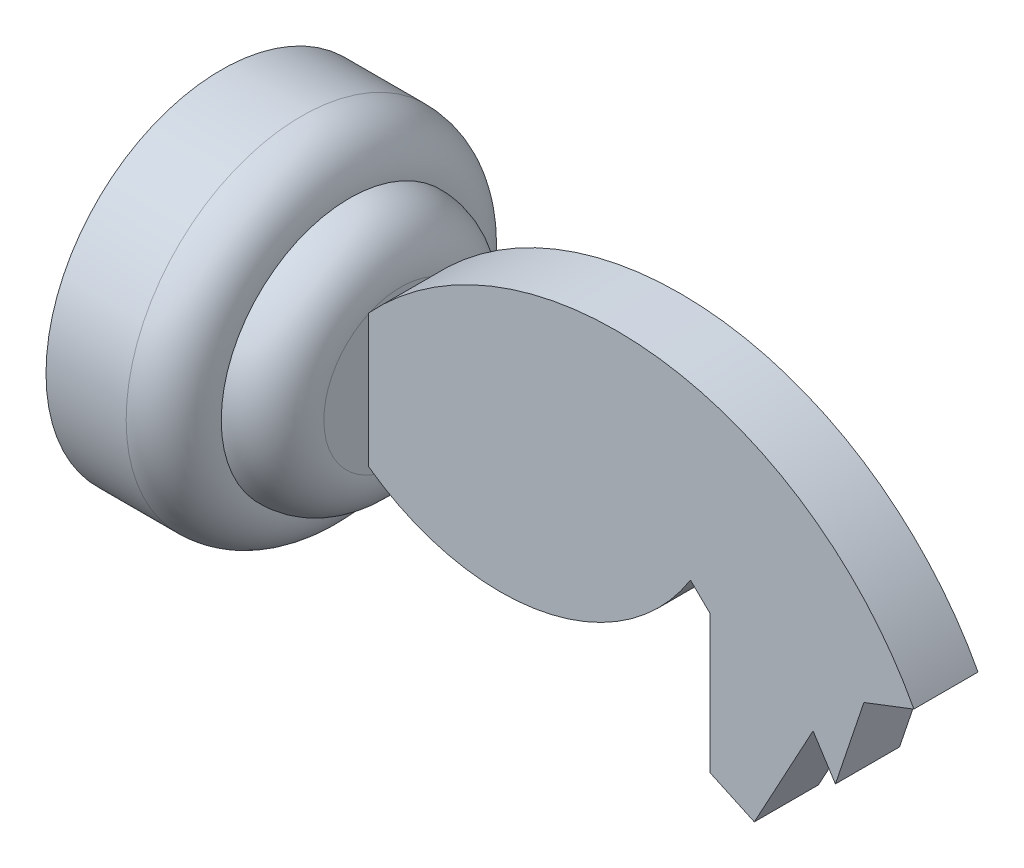
ISO-10303-21;
HEADER;
FILE_DESCRIPTION(('STEP AP214'),'2;1');
FILE_NAME('part.step','',(''),(''),'','','');
FILE_SCHEMA(('AUTOMOTIVE_DESIGN { 1 0 10303 214 1 1 1 1 }'));
ENDSEC;
DATA;
#1=APPLICATION_CONTEXT('core data for automotive mechanical design processes');
#2=APPLICATION_PROTOCOL_DEFINITION('international standard','automotive_design',2000,#1);
#3=PRODUCT_CONTEXT('',#1,'mechanical');
#4=PRODUCT('Part','Part','',(#3));
#5=PRODUCT_RELATED_PRODUCT_CATEGORY('part','',(#4));
#6=PRODUCT_DEFINITION_FORMATION('','',#4);
#7=PRODUCT_DEFINITION_CONTEXT('part definition',#1,'design');
#8=PRODUCT_DEFINITION('design','',#6,#7);
#9=PRODUCT_DEFINITION_SHAPE('','',#8);
#10=(LENGTH_UNIT() NAMED_UNIT(*) SI_UNIT(.MILLI.,.METRE.));
#11=(NAMED_UNIT(*) PLANE_ANGLE_UNIT() SI_UNIT($,.RADIAN.));
#12=(NAMED_UNIT(*) SI_UNIT($,.STERADIAN.) SOLID_ANGLE_UNIT());
#13=UNCERTAINTY_MEASURE_WITH_UNIT(LENGTH_MEASURE(1.E-05),#10,'distance_accuracy_value','');
#14=(GEOMETRIC_REPRESENTATION_CONTEXT(3) GLOBAL_UNCERTAINTY_ASSIGNED_CONTEXT((#13)) GLOBAL_UNIT_ASSIGNED_CONTEXT((#10,
#11,#12)) REPRESENTATION_CONTEXT('',''));
#15=CARTESIAN_POINT('',(0.,0.,0.));
#16=DIRECTION('',(0.,0.,1.));
#17=DIRECTION('',(1.,0.,0.));
#18=AXIS2_PLACEMENT_3D('',#15,#16,#17);
#19=CARTESIAN_POINT('',(11.2,0.,0.));
#20=DIRECTION('',(1.,0.,0.));
#21=DIRECTION('',(0.,0.,-1.));
#22=AXIS2_PLACEMENT_3D('',#19,#20,#21);
#23=PLANE('',#22);
#24=DIRECTION('',(0.,0.,-1.));
#25=VECTOR('',#24,1.);
#26=CARTESIAN_POINT('',(11.2,4.4,2.));
#27=LINE('',#26,#25);
#28=CARTESIAN_POINT('',(11.2,4.4,1.91833260932509));
#29=VERTEX_POINT('',#28);
#30=CARTESIAN_POINT('',(11.2,4.4,-1.91833260932509));
#31=VERTEX_POINT('',#30);
#32=EDGE_CURVE('E155',#29,#31,#27,.T.);
#33=ORIENTED_EDGE('',*,*,#32,.T.);
#34=CARTESIAN_POINT('',(11.2,0.,0.));
#35=DIRECTION('',(-1.,0.,0.));
#36=DIRECTION('',(0.,0.,1.));
#37=AXIS2_PLACEMENT_3D('',#34,#35,#36);
#38=CIRCLE('',#37,4.8);
#39=EDGE_CURVE('E55',#29,#31,#38,.T.);
#40=ORIENTED_EDGE('',*,*,#39,.F.);
#41=EDGE_LOOP('',(#33,#40));
#42=FACE_BOUND('',#41,.T.);
#43=ADVANCED_FACE('F46',(#42),#23,.T.);
#44=DIRECTION('',(0.,1.,0.));
#45=VECTOR('',#44,1.);
#46=CARTESIAN_POINT('',(11.2,0.,2.));
#47=LINE('',#46,#45);
#48=CARTESIAN_POINT('',(11.2,-3.91497825520678,2.));
#49=VERTEX_POINT('',#48);
#50=CARTESIAN_POINT('',(11.2,4.36348484585429,2.));
#51=VERTEX_POINT('',#50);
#52=EDGE_CURVE('E147',#49,#51,#47,.T.);
#53=ORIENTED_EDGE('',*,*,#52,.T.);
#54=CARTESIAN_POINT('',(11.2,4.36348484585429,-2.));
#55=VERTEX_POINT('',#54);
#56=EDGE_CURVE('E56',#55,#51,#38,.T.);
#57=ORIENTED_EDGE('',*,*,#56,.F.);
#58=DIRECTION('',(0.,1.,0.));
#59=VECTOR('',#58,1.);
#60=CARTESIAN_POINT('',(11.2,0.,-2.));
#61=LINE('',#60,#59);
#62=CARTESIAN_POINT('',(11.2,-3.91497825520678,-2.));
#63=VERTEX_POINT('',#62);
#64=EDGE_CURVE('E63',#63,#55,#61,.T.);
#65=ORIENTED_EDGE('',*,*,#64,.F.);
#66=DIRECTION('',(0.,0.,-1.));
#67=VECTOR('',#66,1.);
#68=CARTESIAN_POINT('',(11.2,-3.91497825520678,2.));
#69=LINE('',#68,#67);
#70=EDGE_CURVE('E225',#49,#63,#69,.T.);
#71=ORIENTED_EDGE('',*,*,#70,.F.);
#72=EDGE_LOOP('',(#53,#57,#65,#71));
#73=FACE_BOUND('',#72,.T.);
#74=ADVANCED_FACE('F48',(#73),#23,.T.);
#75=CARTESIAN_POINT('',(8.,0.,0.));
#76=DIRECTION('',(-1.,0.,0.));
#77=DIRECTION('',(0.,0.,1.));
#78=AXIS2_PLACEMENT_3D('',#75,#76,#77);
#79=TOROIDAL_SURFACE('',#78,4.8,3.2);
#80=CARTESIAN_POINT('',(8.,0.,0.));
#81=DIRECTION('',(-1.,0.,0.));
#82=DIRECTION('',(0.,0.,1.));
#83=AXIS2_PLACEMENT_3D('',#80,#81,#82);
#84=CIRCLE('',#83,8.);
#85=CARTESIAN_POINT('',(8.,0.,8.));
#86=VERTEX_POINT('',#85);
#87=EDGE_CURVE('E237',#86,#86,#84,.T.);
#88=ORIENTED_EDGE('',*,*,#87,.F.);
#89=EDGE_LOOP('',(#88));
#90=FACE_BOUND('',#89,.T.);
#91=EDGE_CURVE('E11',#51,#29,#38,.T.);
#92=ORIENTED_EDGE('',*,*,#91,.T.);
#93=ORIENTED_EDGE('',*,*,#39,.T.);
#94=EDGE_CURVE('E70',#31,#55,#38,.T.);
#95=ORIENTED_EDGE('',*,*,#94,.T.);
#96=ORIENTED_EDGE('',*,*,#56,.T.);
#97=EDGE_LOOP('',(#92,#93,#95,#96));
#98=FACE_BOUND('',#97,.T.);
#99=ADVANCED_FACE('F245',(#90,#98),#79,.T.);
#100=CARTESIAN_POINT('',(5.00082007231622,0.,0.));
#101=DIRECTION('',(-1.,0.,0.));
#102=DIRECTION('',(0.,0.,1.));
#103=AXIS2_PLACEMENT_3D('',#100,#101,#102);
#104=TOROIDAL_SURFACE('',#103,7.92985898932354,3.);
#105=CARTESIAN_POINT('',(5.,0.,0.));
#106=DIRECTION('',(-1.,0.,0.));
#107=DIRECTION('',(0.,0.,1.));
#108=AXIS2_PLACEMENT_3D('',#105,#106,#107);
#109=CIRCLE('',#108,10.9298588772371);
#110=CARTESIAN_POINT('',(5.,0.,10.9298588772371));
#111=VERTEX_POINT('',#110);
#112=EDGE_CURVE('E235',#111,#111,#109,.T.);
#113=ORIENTED_EDGE('',*,*,#112,.F.);
#114=EDGE_LOOP('',(#113));
#115=FACE_BOUND('',#114,.T.);
#116=ORIENTED_EDGE('',*,*,#87,.T.);
#117=EDGE_LOOP('',(#116));
#118=FACE_BOUND('',#117,.T.);
#119=ADVANCED_FACE('F293',(#115,#118),#104,.T.);
#120=CARTESIAN_POINT('',(0.,0.,0.));
#121=DIRECTION('',(-1.,0.,0.));
#122=DIRECTION('',(0.,0.,1.));
#123=AXIS2_PLACEMENT_3D('',#120,#121,#122);
#124=CYLINDRICAL_SURFACE('',#123,10.9298588772371);
#125=ORIENTED_EDGE('',*,*,#112,.T.);
#126=EDGE_LOOP('',(#125));
#127=FACE_BOUND('',#126,.T.);
#128=CARTESIAN_POINT('',(0.,0.,0.));
#129=DIRECTION('',(-1.,0.,0.));
#130=DIRECTION('',(0.,0.,1.));
#131=AXIS2_PLACEMENT_3D('',#128,#129,#130);
#132=CIRCLE('',#131,10.9298588772371);
#133=CARTESIAN_POINT('',(0.,0.,10.9298588772371));
#134=VERTEX_POINT('',#133);
#135=EDGE_CURVE('E232',#134,#134,#132,.T.);
#136=ORIENTED_EDGE('',*,*,#135,.F.);
#137=EDGE_LOOP('',(#136));
#138=FACE_BOUND('',#137,.T.);
#139=ADVANCED_FACE('F334',(#127,#138),#124,.T.);
#140=CARTESIAN_POINT('',(0.,0.,0.));
#141=DIRECTION('',(-1.,0.,0.));
#142=DIRECTION('',(0.,0.,1.));
#143=AXIS2_PLACEMENT_3D('',#140,#141,#142);
#144=PLANE('',#143);
#145=ORIENTED_EDGE('',*,*,#135,.T.);
#146=EDGE_LOOP('',(#145));
#147=FACE_BOUND('',#146,.T.);
#148=ADVANCED_FACE('F331',(#147),#144,.T.);
#149=CARTESIAN_POINT('',(11.2,0.,2.));
#150=DIRECTION('',(-1.,0.,0.));
#151=DIRECTION('',(0.,0.,1.));
#152=AXIS2_PLACEMENT_3D('',#149,#150,#151);
#153=PLANE('',#152);
#154=ORIENTED_EDGE('',*,*,#91,.F.);
#155=CARTESIAN_POINT('',(11.2,4.4,2.));
#156=VERTEX_POINT('',#155);
#157=EDGE_CURVE('E139',#51,#156,#47,.T.);
#158=ORIENTED_EDGE('',*,*,#157,.T.);
#159=EDGE_CURVE('E142',#156,#29,#27,.T.);
#160=ORIENTED_EDGE('',*,*,#159,.T.);
#161=EDGE_LOOP('',(#154,#158,#160));
#162=FACE_BOUND('',#161,.T.);
#163=ADVANCED_FACE('F141',(#162),#153,.T.);
#164=CARTESIAN_POINT('',(26.6430950023222,-9.83062952751044,2.));
#165=DIRECTION('',(0.,0.,-1.));
#166=DIRECTION('',(-1.,0.,0.));
#167=AXIS2_PLACEMENT_3D('',#164,#165,#166);
#168=CYLINDRICAL_SURFACE('',#167,21.);
#169=CARTESIAN_POINT('',(26.6430950023222,-9.83062952751044,-2.));
#170=DIRECTION('',(0.,0.,1.));
#171=DIRECTION('',(1.,0.,0.));
#172=AXIS2_PLACEMENT_3D('',#169,#170,#171);
#173=CIRCLE('',#172,21.);
#174=CARTESIAN_POINT('',(11.2,4.4,-2.));
#175=VERTEX_POINT('',#174);
#176=CARTESIAN_POINT('',(45.2,0.,-2.));
#177=VERTEX_POINT('',#176);
#178=EDGE_CURVE('E186',#175,#177,#173,.F.);
#179=ORIENTED_EDGE('',*,*,#178,.F.);
#180=EDGE_CURVE('E158',#31,#175,#27,.T.);
#181=ORIENTED_EDGE('',*,*,#180,.F.);
#182=ORIENTED_EDGE('',*,*,#32,.F.);
#183=ORIENTED_EDGE('',*,*,#159,.F.);
#184=CARTESIAN_POINT('',(26.6430950023222,-9.83062952751044,2.));
#185=DIRECTION('',(0.,0.,1.));
#186=DIRECTION('',(1.,0.,0.));
#187=AXIS2_PLACEMENT_3D('',#184,#185,#186);
#188=CIRCLE('',#187,21.);
#189=CARTESIAN_POINT('',(45.2,0.,2.));
#190=VERTEX_POINT('',#189);
#191=EDGE_CURVE('E148',#156,#190,#188,.F.);
#192=ORIENTED_EDGE('',*,*,#191,.T.);
#193=DIRECTION('',(0.,0.,-1.));
#194=VECTOR('',#193,1.);
#195=CARTESIAN_POINT('',(45.2,0.,2.));
#196=LINE('',#195,#194);
#197=EDGE_CURVE('E185',#190,#177,#196,.T.);
#198=ORIENTED_EDGE('',*,*,#197,.T.);
#199=EDGE_LOOP('',(#179,#181,#182,#183,#192,#198));
#200=FACE_BOUND('',#199,.T.);
#201=ADVANCED_FACE('F153',(#200),#168,.T.);
#202=ORIENTED_EDGE('',*,*,#94,.F.);
#203=ORIENTED_EDGE('',*,*,#180,.T.);
#204=EDGE_CURVE('E189',#55,#175,#61,.T.);
#205=ORIENTED_EDGE('',*,*,#204,.F.);
#206=EDGE_LOOP('',(#202,#203,#205));
#207=FACE_BOUND('',#206,.T.);
#208=ADVANCED_FACE('F247',(#207),#153,.T.);
#209=CARTESIAN_POINT('',(19.3994308478551,7.43267937847441,2.));
#210=DIRECTION('',(0.,0.,-1.));
#211=DIRECTION('',(-1.,0.,0.));
#212=AXIS2_PLACEMENT_3D('',#209,#210,#211);
#213=CYLINDRICAL_SURFACE('',#212,14.);
#214=CARTESIAN_POINT('',(19.3994308478551,7.43267937847441,-2.));
#215=DIRECTION('',(0.,0.,1.));
#216=DIRECTION('',(1.,0.,0.));
#217=AXIS2_PLACEMENT_3D('',#214,#215,#216);
#218=CIRCLE('',#217,14.);
#219=CARTESIAN_POINT('',(31.263463773332,0.,-2.));
#220=VERTEX_POINT('',#219);
#221=EDGE_CURVE('E191',#220,#63,#218,.F.);
#222=ORIENTED_EDGE('',*,*,#221,.F.);
#223=DIRECTION('',(0.,0.,-1.));
#224=VECTOR('',#223,1.);
#225=CARTESIAN_POINT('',(31.263463773332,0.,2.));
#226=LINE('',#225,#224);
#227=CARTESIAN_POINT('',(31.263463773332,0.,2.));
#228=VERTEX_POINT('',#227);
#229=EDGE_CURVE('E223',#228,#220,#226,.T.);
#230=ORIENTED_EDGE('',*,*,#229,.F.);
#231=CARTESIAN_POINT('',(19.3994308478551,7.43267937847441,2.));
#232=DIRECTION('',(0.,0.,1.));
#233=DIRECTION('',(1.,0.,0.));
#234=AXIS2_PLACEMENT_3D('',#231,#232,#233);
#235=CIRCLE('',#234,14.);
#236=EDGE_CURVE('E169',#228,#49,#235,.F.);
#237=ORIENTED_EDGE('',*,*,#236,.T.);
#238=ORIENTED_EDGE('',*,*,#70,.T.);
#239=EDGE_LOOP('',(#222,#230,#237,#238));
#240=FACE_BOUND('',#239,.T.);
#241=ADVANCED_FACE('F285',(#240),#213,.T.);
#242=CARTESIAN_POINT('',(15.1403569656046,15.6240069272758,2.));
#243=DIRECTION('',(0.695904285191115,0.71813454578696,0.));
#244=DIRECTION('',(-0.71813454578696,0.695904285191115,0.));
#245=AXIS2_PLACEMENT_3D('',#242,#243,#244);
#246=PLANE('',#245);
#247=DIRECTION('',(0.71813454578696,-0.695904285191115,0.));
#248=VECTOR('',#247,1.);
#249=CARTESIAN_POINT('',(15.1403569656046,15.6240069272758,-2.));
#250=LINE('',#249,#248);
#251=CARTESIAN_POINT('',(32.498964702066,-1.19725529945281,-2.));
#252=VERTEX_POINT('',#251);
#253=EDGE_CURVE('E193',#220,#252,#250,.T.);
#254=ORIENTED_EDGE('',*,*,#253,.T.);
#255=DIRECTION('',(0.,0.,-1.));
#256=VECTOR('',#255,1.);
#257=CARTESIAN_POINT('',(32.498964702066,-1.19725529945281,2.));
#258=LINE('',#257,#256);
#259=CARTESIAN_POINT('',(32.498964702066,-1.19725529945281,2.));
#260=VERTEX_POINT('',#259);
#261=EDGE_CURVE('E220',#260,#252,#258,.T.);
#262=ORIENTED_EDGE('',*,*,#261,.F.);
#263=DIRECTION('',(0.71813454578696,-0.695904285191115,0.));
#264=VECTOR('',#263,1.);
#265=CARTESIAN_POINT('',(15.1403569656046,15.6240069272758,2.));
#266=LINE('',#265,#264);
#267=EDGE_CURVE('E172',#228,#260,#266,.T.);
#268=ORIENTED_EDGE('',*,*,#267,.F.);
#269=ORIENTED_EDGE('',*,*,#229,.T.);
#270=EDGE_LOOP('',(#254,#262,#268,#269));
#271=FACE_BOUND('',#270,.T.);
#272=ADVANCED_FACE('F281',(#271),#246,.F.);
#273=CARTESIAN_POINT('',(32.498964702066,0.,2.));
#274=DIRECTION('',(1.,0.,0.));
#275=DIRECTION('',(0.,0.,-1.));
#276=AXIS2_PLACEMENT_3D('',#273,#274,#275);
#277=PLANE('',#276);
#278=DIRECTION('',(0.,-1.,0.));
#279=VECTOR('',#278,1.);
#280=CARTESIAN_POINT('',(32.498964702066,0.,-2.));
#281=LINE('',#280,#279);
#282=CARTESIAN_POINT('',(32.498964702066,-9.79725529945281,-2.));
#283=VERTEX_POINT('',#282);
#284=EDGE_CURVE('E195',#252,#283,#281,.T.);
#285=ORIENTED_EDGE('',*,*,#284,.T.);
#286=DIRECTION('',(0.,0.,-1.));
#287=VECTOR('',#286,1.);
#288=CARTESIAN_POINT('',(32.498964702066,-9.79725529945281,2.));
#289=LINE('',#288,#287);
#290=CARTESIAN_POINT('',(32.498964702066,-9.79725529945281,2.));
#291=VERTEX_POINT('',#290);
#292=EDGE_CURVE('E217',#291,#283,#289,.T.);
#293=ORIENTED_EDGE('',*,*,#292,.F.);
#294=DIRECTION('',(0.,-1.,0.));
#295=VECTOR('',#294,1.);
#296=CARTESIAN_POINT('',(32.498964702066,0.,2.));
#297=LINE('',#296,#295);
#298=EDGE_CURVE('E174',#260,#291,#297,.T.);
#299=ORIENTED_EDGE('',*,*,#298,.F.);
#300=ORIENTED_EDGE('',*,*,#261,.T.);
#301=EDGE_LOOP('',(#285,#293,#299,#300));
#302=FACE_BOUND('',#301,.T.);
#303=ADVANCED_FACE('F277',(#302),#277,.F.);
#304=CARTESIAN_POINT('',(1.99946445082386,4.3197897508319,2.));
#305=DIRECTION('',(0.420047755956167,0.907502001494316,0.));
#306=DIRECTION('',(-0.907502001494316,0.420047755956167,0.));
#307=AXIS2_PLACEMENT_3D('',#304,#305,#306);
#308=PLANE('',#307);
#309=DIRECTION('',(0.907502001494316,-0.420047755956167,0.));
#310=VECTOR('',#309,1.);
#311=CARTESIAN_POINT('',(1.99946445082386,4.3197897508319,-2.));
#312=LINE('',#311,#310);
#313=CARTESIAN_POINT('',(35.2486957665938,-11.07,-2.));
#314=VERTEX_POINT('',#313);
#315=EDGE_CURVE('E197',#283,#314,#312,.T.);
#316=ORIENTED_EDGE('',*,*,#315,.T.);
#317=DIRECTION('',(0.,0.,-1.));
#318=VECTOR('',#317,1.);
#319=CARTESIAN_POINT('',(35.2486957665938,-11.07,2.));
#320=LINE('',#319,#318);
#321=CARTESIAN_POINT('',(35.2486957665938,-11.07,2.));
#322=VERTEX_POINT('',#321);
#323=EDGE_CURVE('E214',#322,#314,#320,.T.);
#324=ORIENTED_EDGE('',*,*,#323,.F.);
#325=DIRECTION('',(0.907502001494316,-0.420047755956167,0.));
#326=VECTOR('',#325,1.);
#327=CARTESIAN_POINT('',(1.99946445082386,4.3197897508319,2.));
#328=LINE('',#327,#326);
#329=EDGE_CURVE('E176',#291,#322,#328,.T.);
#330=ORIENTED_EDGE('',*,*,#329,.F.);
#331=ORIENTED_EDGE('',*,*,#292,.T.);
#332=EDGE_LOOP('',(#316,#324,#330,#331));
#333=FACE_BOUND('',#332,.T.);
#334=ADVANCED_FACE('F272',(#333),#308,.F.);
#335=CARTESIAN_POINT('',(31.8696932080387,-17.2961223907554,2.));
#336=DIRECTION('',(-0.87890625,0.47699455312502,0.));
#337=DIRECTION('',(-0.47699455312502,-0.87890625,0.));
#338=AXIS2_PLACEMENT_3D('',#335,#336,#337);
#339=PLANE('',#338);
#340=DIRECTION('',(0.47699455312502,0.87890625,0.));
#341=VECTOR('',#340,1.);
#342=CARTESIAN_POINT('',(31.8696932080387,-17.2961223907554,-2.));
#343=LINE('',#342,#341);
#344=CARTESIAN_POINT('',(38.9120139345939,-4.32,-2.));
#345=VERTEX_POINT('',#344);
#346=EDGE_CURVE('E199',#314,#345,#343,.T.);
#347=ORIENTED_EDGE('',*,*,#346,.T.);
#348=DIRECTION('',(0.,0.,-1.));
#349=VECTOR('',#348,1.);
#350=CARTESIAN_POINT('',(38.9120139345939,-4.32,2.));
#351=LINE('',#350,#349);
#352=CARTESIAN_POINT('',(38.9120139345939,-4.32,2.));
#353=VERTEX_POINT('',#352);
#354=EDGE_CURVE('E211',#353,#345,#351,.T.);
#355=ORIENTED_EDGE('',*,*,#354,.F.);
#356=DIRECTION('',(0.47699455312502,0.87890625,0.));
#357=VECTOR('',#356,1.);
#358=CARTESIAN_POINT('',(31.8696932080387,-17.2961223907554,2.));
#359=LINE('',#358,#357);
#360=EDGE_CURVE('E178',#322,#353,#359,.T.);
#361=ORIENTED_EDGE('',*,*,#360,.F.);
#362=ORIENTED_EDGE('',*,*,#323,.T.);
#363=EDGE_LOOP('',(#347,#355,#361,#362));
#364=FACE_BOUND('',#363,.T.);
#365=ADVANCED_FACE('F266',(#364),#339,.F.);
#366=CARTESIAN_POINT('',(25.561946300607,16.4389062035767,2.));
#367=DIRECTION('',(0.84108527131783,0.540902547943909,0.));
#368=DIRECTION('',(-0.540902547943909,0.84108527131783,0.));
#369=AXIS2_PLACEMENT_3D('',#366,#367,#368);
#370=PLANE('',#369);
#371=DIRECTION('',(0.540902547943909,-0.84108527131783,0.));
#372=VECTOR('',#371,1.);
#373=CARTESIAN_POINT('',(25.561946300607,16.4389062035767,-2.));
#374=LINE('',#373,#372);
#375=CARTESIAN_POINT('',(40.3075425082892,-6.49,-2.));
#376=VERTEX_POINT('',#375);
#377=EDGE_CURVE('E201',#345,#376,#374,.T.);
#378=ORIENTED_EDGE('',*,*,#377,.T.);
#379=DIRECTION('',(0.,0.,-1.));
#380=VECTOR('',#379,1.);
#381=CARTESIAN_POINT('',(40.3075425082892,-6.49,2.));
#382=LINE('',#381,#380);
#383=CARTESIAN_POINT('',(40.3075425082892,-6.49,2.));
#384=VERTEX_POINT('',#383);
#385=EDGE_CURVE('E208',#384,#376,#382,.T.);
#386=ORIENTED_EDGE('',*,*,#385,.F.);
#387=DIRECTION('',(0.540902547943909,-0.84108527131783,0.));
#388=VECTOR('',#387,1.);
#389=CARTESIAN_POINT('',(25.561946300607,16.4389062035767,2.));
#390=LINE('',#389,#388);
#391=EDGE_CURVE('E180',#353,#384,#390,.T.);
#392=ORIENTED_EDGE('',*,*,#391,.F.);
#393=ORIENTED_EDGE('',*,*,#354,.T.);
#394=EDGE_LOOP('',(#378,#386,#392,#393));
#395=FACE_BOUND('',#394,.T.);
#396=ADVANCED_FACE('F262',(#395),#370,.F.);
#397=CARTESIAN_POINT('',(38.1844392608772,-12.8157644415364,2.));
#398=DIRECTION('',(-0.948028673835126,0.318184904711731,0.));
#399=DIRECTION('',(-0.318184904711731,-0.948028673835126,0.));
#400=AXIS2_PLACEMENT_3D('',#397,#398,#399);
#401=PLANE('',#400);
#402=DIRECTION('',(0.318184904711731,0.948028673835126,0.));
#403=VECTOR('',#402,1.);
#404=CARTESIAN_POINT('',(38.1844392608772,-12.8157644415364,-2.));
#405=LINE('',#404,#403);
#406=CARTESIAN_POINT('',(42.0830142765807,-1.2,-2.));
#407=VERTEX_POINT('',#406);
#408=EDGE_CURVE('E166',#376,#407,#405,.T.);
#409=ORIENTED_EDGE('',*,*,#408,.T.);
#410=DIRECTION('',(0.,0.,-1.));
#411=VECTOR('',#410,1.);
#412=CARTESIAN_POINT('',(42.0830142765807,-1.2,2.));
#413=LINE('',#412,#411);
#414=CARTESIAN_POINT('',(42.0830142765807,-1.2,2.));
#415=VERTEX_POINT('',#414);
#416=EDGE_CURVE('E205',#415,#407,#413,.T.);
#417=ORIENTED_EDGE('',*,*,#416,.F.);
#418=DIRECTION('',(0.318184904711731,0.948028673835126,0.));
#419=VECTOR('',#418,1.);
#420=CARTESIAN_POINT('',(38.1844392608772,-12.8157644415364,2.));
#421=LINE('',#420,#419);
#422=EDGE_CURVE('E182',#384,#415,#421,.T.);
#423=ORIENTED_EDGE('',*,*,#422,.F.);
#424=ORIENTED_EDGE('',*,*,#385,.T.);
#425=EDGE_LOOP('',(#409,#417,#423,#424));
#426=FACE_BOUND('',#425,.T.);
#427=ADVANCED_FACE('F257',(#426),#401,.F.);
#428=CARTESIAN_POINT('',(5.83455842805408,-15.1551961022505,2.));
#429=DIRECTION('',(-0.359281437125749,0.933229258508785,0.));
#430=DIRECTION('',(-0.933229258508785,-0.359281437125749,0.));
#431=AXIS2_PLACEMENT_3D('',#428,#429,#430);
#432=PLANE('',#431);
#433=DIRECTION('',(0.933229258508785,0.359281437125749,0.));
#434=VECTOR('',#433,1.);
#435=CARTESIAN_POINT('',(5.83455842805408,-15.1551961022505,-2.));
#436=LINE('',#435,#434);
#437=EDGE_CURVE('E163',#407,#177,#436,.T.);
#438=ORIENTED_EDGE('',*,*,#437,.T.);
#439=ORIENTED_EDGE('',*,*,#197,.F.);
#440=DIRECTION('',(0.933229258508785,0.359281437125749,0.));
#441=VECTOR('',#440,1.);
#442=CARTESIAN_POINT('',(5.83455842805408,-15.1551961022505,2.));
#443=LINE('',#442,#441);
#444=EDGE_CURVE('E161',#415,#190,#443,.T.);
#445=ORIENTED_EDGE('',*,*,#444,.F.);
#446=ORIENTED_EDGE('',*,*,#416,.T.);
#447=EDGE_LOOP('',(#438,#439,#445,#446));
#448=FACE_BOUND('',#447,.T.);
#449=ADVANCED_FACE('F251',(#448),#432,.F.);
#450=CARTESIAN_POINT('',(0.,0.,2.));
#451=DIRECTION('',(0.,0.,1.));
#452=DIRECTION('',(1.,0.,0.));
#453=AXIS2_PLACEMENT_3D('',#450,#451,#452);
#454=PLANE('',#453);
#455=ORIENTED_EDGE('',*,*,#191,.F.);
#456=ORIENTED_EDGE('',*,*,#157,.F.);
#457=ORIENTED_EDGE('',*,*,#52,.F.);
#458=ORIENTED_EDGE('',*,*,#236,.F.);
#459=ORIENTED_EDGE('',*,*,#267,.T.);
#460=ORIENTED_EDGE('',*,*,#298,.T.);
#461=ORIENTED_EDGE('',*,*,#329,.T.);
#462=ORIENTED_EDGE('',*,*,#360,.T.);
#463=ORIENTED_EDGE('',*,*,#391,.T.);
#464=ORIENTED_EDGE('',*,*,#422,.T.);
#465=ORIENTED_EDGE('',*,*,#444,.T.);
#466=EDGE_LOOP('',(#455,#456,#457,#458,#459,#460,#461,#462,#463,#464,#465));
#467=FACE_BOUND('',#466,.T.);
#468=ADVANCED_FACE('F159',(#467),#454,.T.);
#469=CARTESIAN_POINT('',(0.,0.,-2.));
#470=DIRECTION('',(0.,0.,1.));
#471=DIRECTION('',(1.,0.,0.));
#472=AXIS2_PLACEMENT_3D('',#469,#470,#471);
#473=PLANE('',#472);
#474=ORIENTED_EDGE('',*,*,#178,.T.);
#475=ORIENTED_EDGE('',*,*,#437,.F.);
#476=ORIENTED_EDGE('',*,*,#408,.F.);
#477=ORIENTED_EDGE('',*,*,#377,.F.);
#478=ORIENTED_EDGE('',*,*,#346,.F.);
#479=ORIENTED_EDGE('',*,*,#315,.F.);
#480=ORIENTED_EDGE('',*,*,#284,.F.);
#481=ORIENTED_EDGE('',*,*,#253,.F.);
#482=ORIENTED_EDGE('',*,*,#221,.T.);
#483=ORIENTED_EDGE('',*,*,#64,.T.);
#484=ORIENTED_EDGE('',*,*,#204,.T.);
#485=EDGE_LOOP('',(#474,#475,#476,#477,#478,#479,#480,#481,#482,#483,#484));
#486=FACE_BOUND('',#485,.T.);
#487=ADVANCED_FACE('F248',(#486),#473,.F.);
#488=CLOSED_SHELL('',(#43,#74,#99,#119,#139,#148,#163,#201,#208,#241,#272,#303,#334,#365,#396,
#427,#449,#468,#487));
#489=CARTESIAN_POINT('',(1.,0.,0.));
#490=DIRECTION('',(-1.,0.,0.));
#491=DIRECTION('',(0.,0.,1.));
#492=AXIS2_PLACEMENT_3D('',#489,#490,#491);
#493=PLANE('',#492);
#494=CARTESIAN_POINT('',(1.,0.,0.));
#495=DIRECTION('',(-1.,0.,0.));
#496=DIRECTION('',(0.,0.,1.));
#497=AXIS2_PLACEMENT_3D('',#494,#495,#496);
#498=CIRCLE('',#497,5.25);
#499=CARTESIAN_POINT('',(1.,0.,5.25));
#500=VERTEX_POINT('',#499);
#501=EDGE_CURVE('E229',#500,#500,#498,.T.);
#502=ORIENTED_EDGE('',*,*,#501,.F.);
#503=EDGE_LOOP('',(#502));
#504=FACE_BOUND('',#503,.T.);
#505=ADVANCED_FACE('F316',(#504),#493,.F.);
#506=CARTESIAN_POINT('',(0.,0.,0.));
#507=DIRECTION('',(-1.,0.,0.));
#508=DIRECTION('',(0.,0.,1.));
#509=AXIS2_PLACEMENT_3D('',#506,#507,#508);
#510=CYLINDRICAL_SURFACE('',#509,5.25);
#511=CARTESIAN_POINT('',(3.5,0.,0.));
#512=DIRECTION('',(-1.,0.,0.));
#513=DIRECTION('',(0.,0.,1.));
#514=AXIS2_PLACEMENT_3D('',#511,#512,#513);
#515=CIRCLE('',#514,5.25);
#516=CARTESIAN_POINT('',(3.5,0.,5.25));
#517=VERTEX_POINT('',#516);
#518=EDGE_CURVE('E156',#517,#517,#515,.T.);
#519=ORIENTED_EDGE('',*,*,#518,.F.);
#520=EDGE_LOOP('',(#519));
#521=FACE_BOUND('',#520,.T.);
#522=ORIENTED_EDGE('',*,*,#501,.T.);
#523=EDGE_LOOP('',(#522));
#524=FACE_BOUND('',#523,.T.);
#525=ADVANCED_FACE('F306',(#521,#524),#510,.F.);
#526=CARTESIAN_POINT('',(3.5,0.,0.));
#527=DIRECTION('',(1.,0.,0.));
#528=DIRECTION('',(0.,0.,-1.));
#529=AXIS2_PLACEMENT_3D('',#526,#527,#528);
#530=PLANE('',#529);
#531=ORIENTED_EDGE('',*,*,#518,.T.);
#532=EDGE_LOOP('',(#531));
#533=FACE_BOUND('',#532,.T.);
#534=ADVANCED_FACE('F302',(#533),#530,.F.);
#535=CLOSED_SHELL('',(#505,#525,#534));
#536=ORIENTED_CLOSED_SHELL('',*,#535,.T.);
#537=BREP_WITH_VOIDS('B2',#488,(#536));
#538=ADVANCED_BREP_SHAPE_REPRESENTATION('',(#18,#537),#14);
#539=SHAPE_DEFINITION_REPRESENTATION(#9,#538);
ENDSEC;
END-ISO-10303-21;
